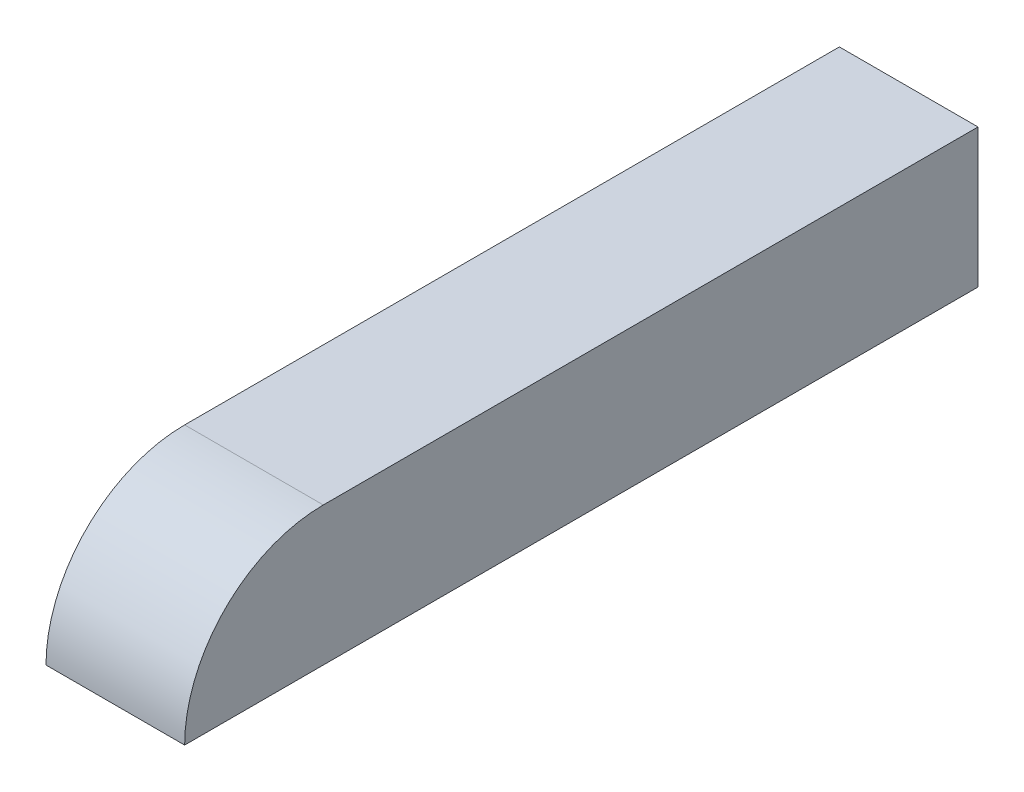
ISO-10303-21;
HEADER;
FILE_DESCRIPTION(('STEP AP214'),'2;1');
FILE_NAME('part.step','',(''),(''),'','','');
FILE_SCHEMA(('AUTOMOTIVE_DESIGN { 1 0 10303 214 1 1 1 1 }'));
ENDSEC;
DATA;
#1=APPLICATION_CONTEXT('core data for automotive mechanical design processes');
#2=APPLICATION_PROTOCOL_DEFINITION('international standard','automotive_design',2000,#1);
#3=PRODUCT_CONTEXT('',#1,'mechanical');
#4=PRODUCT('Part','Part','',(#3));
#5=PRODUCT_RELATED_PRODUCT_CATEGORY('part','',(#4));
#6=PRODUCT_DEFINITION_FORMATION('','',#4);
#7=PRODUCT_DEFINITION_CONTEXT('part definition',#1,'design');
#8=PRODUCT_DEFINITION('design','',#6,#7);
#9=PRODUCT_DEFINITION_SHAPE('','',#8);
#10=(LENGTH_UNIT() NAMED_UNIT(*) SI_UNIT(.MILLI.,.METRE.));
#11=(NAMED_UNIT(*) PLANE_ANGLE_UNIT() SI_UNIT($,.RADIAN.));
#12=(NAMED_UNIT(*) SI_UNIT($,.STERADIAN.) SOLID_ANGLE_UNIT());
#13=UNCERTAINTY_MEASURE_WITH_UNIT(LENGTH_MEASURE(1.E-05),#10,'distance_accuracy_value','');
#14=(GEOMETRIC_REPRESENTATION_CONTEXT(3) GLOBAL_UNCERTAINTY_ASSIGNED_CONTEXT((#13)) GLOBAL_UNIT_ASSIGNED_CONTEXT((#10,
#11,#12)) REPRESENTATION_CONTEXT('',''));
#15=CARTESIAN_POINT('',(0.,0.,0.));
#16=DIRECTION('',(0.,0.,1.));
#17=DIRECTION('',(1.,0.,0.));
#18=AXIS2_PLACEMENT_3D('',#15,#16,#17);
#19=CARTESIAN_POINT('',(13.7705009063984,46.2267058219209,11.5230796597994));
#20=DIRECTION('',(0.,0.,-1.));
#21=DIRECTION('',(-1.,0.,0.));
#22=AXIS2_PLACEMENT_3D('',#19,#20,#21);
#23=PLANE('',#22);
#24=DIRECTION('',(0.,1.,0.));
#25=VECTOR('',#24,1.);
#26=CARTESIAN_POINT('',(31.7705009063984,46.2267058219209,11.5230796597994));
#27=LINE('',#26,#25);
#28=CARTESIAN_POINT('',(31.7705009063984,28.2267058219209,11.5230796597994));
#29=VERTEX_POINT('',#28);
#30=CARTESIAN_POINT('',(31.7705009063984,46.2267058219209,11.5230796597994));
#31=VERTEX_POINT('',#30);
#32=EDGE_CURVE('E176',#29,#31,#27,.T.);
#33=ORIENTED_EDGE('',*,*,#32,.F.);
#34=DIRECTION('',(1.,0.,0.));
#35=VECTOR('',#34,1.);
#36=CARTESIAN_POINT('',(13.7705009063984,28.2267058219209,11.5230796597994));
#37=LINE('',#36,#35);
#38=CARTESIAN_POINT('',(13.7705009063984,28.2267058219209,11.5230796597994));
#39=VERTEX_POINT('',#38);
#40=EDGE_CURVE('E174',#39,#29,#37,.T.);
#41=ORIENTED_EDGE('',*,*,#40,.F.);
#42=DIRECTION('',(0.,1.,0.));
#43=VECTOR('',#42,1.);
#44=CARTESIAN_POINT('',(13.7705009063984,46.2267058219209,11.5230796597994));
#45=LINE('',#44,#43);
#46=CARTESIAN_POINT('',(13.7705009063984,46.2267058219209,11.5230796597994));
#47=VERTEX_POINT('',#46);
#48=EDGE_CURVE('E164',#39,#47,#45,.T.);
#49=ORIENTED_EDGE('',*,*,#48,.T.);
#50=DIRECTION('',(1.,0.,0.));
#51=VECTOR('',#50,1.);
#52=CARTESIAN_POINT('',(13.7705009063984,46.2267058219209,11.5230796597994));
#53=LINE('',#52,#51);
#54=EDGE_CURVE('E187',#47,#31,#53,.T.);
#55=ORIENTED_EDGE('',*,*,#54,.T.);
#56=EDGE_LOOP('',(#33,#41,#49,#55));
#57=FACE_BOUND('',#56,.T.);
#58=DIRECTION('',(1.,0.,0.));
#59=VECTOR('',#58,1.);
#60=CARTESIAN_POINT('',(13.7705009063984,31.2267058219209,11.5230796597994));
#61=LINE('',#60,#59);
#62=CARTESIAN_POINT('',(16.7705009063984,31.2267058219209,11.5230796597994));
#63=VERTEX_POINT('',#62);
#64=CARTESIAN_POINT('',(28.7705009063984,31.2267058219209,11.5230796597994));
#65=VERTEX_POINT('',#64);
#66=EDGE_CURVE('E151',#63,#65,#61,.T.);
#67=ORIENTED_EDGE('',*,*,#66,.T.);
#68=DIRECTION('',(0.,1.,0.));
#69=VECTOR('',#68,1.);
#70=CARTESIAN_POINT('',(28.7705009063984,46.2267058219209,11.5230796597994));
#71=LINE('',#70,#69);
#72=CARTESIAN_POINT('',(28.7705009063984,43.2267058219209,11.5230796597994));
#73=VERTEX_POINT('',#72);
#74=EDGE_CURVE('E137',#65,#73,#71,.T.);
#75=ORIENTED_EDGE('',*,*,#74,.T.);
#76=DIRECTION('',(1.,0.,0.));
#77=VECTOR('',#76,1.);
#78=CARTESIAN_POINT('',(13.7705009063984,43.2267058219209,11.5230796597994));
#79=LINE('',#78,#77);
#80=CARTESIAN_POINT('',(16.7705009063984,43.2267058219209,11.5230796597994));
#81=VERTEX_POINT('',#80);
#82=EDGE_CURVE('E157',#81,#73,#79,.T.);
#83=ORIENTED_EDGE('',*,*,#82,.F.);
#84=DIRECTION('',(0.,1.,0.));
#85=VECTOR('',#84,1.);
#86=CARTESIAN_POINT('',(16.7705009063984,28.2267058219209,11.5230796597994));
#87=LINE('',#86,#85);
#88=EDGE_CURVE('E155',#63,#81,#87,.T.);
#89=ORIENTED_EDGE('',*,*,#88,.F.);
#90=EDGE_LOOP('',(#67,#75,#83,#89));
#91=FACE_BOUND('',#90,.T.);
#92=ADVANCED_FACE('F36',(#57,#91),#23,.T.);
#93=CARTESIAN_POINT('',(13.7705009063984,31.2267058219209,96.5230796597994));
#94=DIRECTION('',(0.,-1.,0.));
#95=DIRECTION('',(0.,0.,-1.));
#96=AXIS2_PLACEMENT_3D('',#93,#94,#95);
#97=PLANE('',#96);
#98=DIRECTION('',(-1.,0.,0.));
#99=VECTOR('',#98,1.);
#100=CARTESIAN_POINT('',(13.7705009063984,31.2267058219209,99.5230796597994));
#101=LINE('',#100,#99);
#102=CARTESIAN_POINT('',(28.7705009063984,31.2267058219209,99.5230796597994));
#103=VERTEX_POINT('',#102);
#104=CARTESIAN_POINT('',(16.7705009063984,31.2267058219209,99.5230796597994));
#105=VERTEX_POINT('',#104);
#106=EDGE_CURVE('E117',#103,#105,#101,.T.);
#107=ORIENTED_EDGE('',*,*,#106,.F.);
#108=DIRECTION('',(0.,0.,-1.));
#109=VECTOR('',#108,1.);
#110=CARTESIAN_POINT('',(28.7705009063984,31.2267058219209,96.5230796597994));
#111=LINE('',#110,#109);
#112=EDGE_CURVE('E129',#103,#65,#111,.T.);
#113=ORIENTED_EDGE('',*,*,#112,.T.);
#114=ORIENTED_EDGE('',*,*,#66,.F.);
#115=DIRECTION('',(0.,0.,-1.));
#116=VECTOR('',#115,1.);
#117=CARTESIAN_POINT('',(16.7705009063984,31.2267058219209,114.523079659799));
#118=LINE('',#117,#116);
#119=EDGE_CURVE('E131',#105,#63,#118,.T.);
#120=ORIENTED_EDGE('',*,*,#119,.F.);
#121=EDGE_LOOP('',(#107,#113,#114,#120));
#122=FACE_BOUND('',#121,.T.);
#123=ADVANCED_FACE('F127',(#122),#97,.F.);
#124=CARTESIAN_POINT('',(13.7705009063984,28.2267058219209,99.5230796597994));
#125=DIRECTION('',(0.,0.,1.));
#126=DIRECTION('',(1.,0.,0.));
#127=AXIS2_PLACEMENT_3D('',#124,#125,#126);
#128=PLANE('',#127);
#129=DIRECTION('',(-1.,0.,0.));
#130=VECTOR('',#129,1.);
#131=CARTESIAN_POINT('',(13.7705009063984,28.2267058219209,99.5230796597994));
#132=LINE('',#131,#130);
#133=CARTESIAN_POINT('',(28.7705009063984,28.2267058219209,99.5230796597994));
#134=VERTEX_POINT('',#133);
#135=CARTESIAN_POINT('',(16.7705009063984,28.2267058219209,99.5230796597994));
#136=VERTEX_POINT('',#135);
#137=EDGE_CURVE('E120',#134,#136,#132,.T.);
#138=ORIENTED_EDGE('',*,*,#137,.F.);
#139=DIRECTION('',(0.,-1.,0.));
#140=VECTOR('',#139,1.);
#141=CARTESIAN_POINT('',(28.7705009063984,28.2267058219209,99.5230796597994));
#142=LINE('',#141,#140);
#143=EDGE_CURVE('E113',#103,#134,#142,.T.);
#144=ORIENTED_EDGE('',*,*,#143,.F.);
#145=ORIENTED_EDGE('',*,*,#106,.T.);
#146=DIRECTION('',(0.,-1.,0.));
#147=VECTOR('',#146,1.);
#148=CARTESIAN_POINT('',(16.7705009063984,28.2267058219209,99.5230796597994));
#149=LINE('',#148,#147);
#150=EDGE_CURVE('E124',#105,#136,#149,.T.);
#151=ORIENTED_EDGE('',*,*,#150,.T.);
#152=EDGE_LOOP('',(#138,#144,#145,#151));
#153=FACE_BOUND('',#152,.T.);
#154=ADVANCED_FACE('F115',(#153),#128,.T.);
#155=CARTESIAN_POINT('',(13.7705009063984,43.2267058219209,96.5230796597994));
#156=DIRECTION('',(0.,1.,0.));
#157=DIRECTION('',(0.,0.,1.));
#158=AXIS2_PLACEMENT_3D('',#155,#156,#157);
#159=PLANE('',#158);
#160=DIRECTION('',(0.,0.,1.));
#161=VECTOR('',#160,1.);
#162=CARTESIAN_POINT('',(28.7705009063984,43.2267058219209,96.5230796597994));
#163=LINE('',#162,#161);
#164=CARTESIAN_POINT('',(28.7705009063984,43.2267058219209,96.5230796597994));
#165=VERTEX_POINT('',#164);
#166=EDGE_CURVE('E140',#73,#165,#163,.T.);
#167=ORIENTED_EDGE('',*,*,#166,.T.);
#168=DIRECTION('',(1.,0.,0.));
#169=VECTOR('',#168,1.);
#170=CARTESIAN_POINT('',(13.7705009063984,43.2267058219209,96.5230796597994));
#171=LINE('',#170,#169);
#172=CARTESIAN_POINT('',(16.7705009063984,43.2267058219209,96.5230796597994));
#173=VERTEX_POINT('',#172);
#174=EDGE_CURVE('E132',#173,#165,#171,.T.);
#175=ORIENTED_EDGE('',*,*,#174,.F.);
#176=DIRECTION('',(0.,0.,1.));
#177=VECTOR('',#176,1.);
#178=CARTESIAN_POINT('',(16.7705009063984,43.2267058219209,114.523079659799));
#179=LINE('',#178,#177);
#180=EDGE_CURVE('E152',#81,#173,#179,.T.);
#181=ORIENTED_EDGE('',*,*,#180,.F.);
#182=ORIENTED_EDGE('',*,*,#82,.T.);
#183=EDGE_LOOP('',(#167,#175,#181,#182));
#184=FACE_BOUND('',#183,.T.);
#185=ADVANCED_FACE('F198',(#184),#159,.F.);
#186=CARTESIAN_POINT('',(16.7705009063984,28.2267058219209,114.523079659799));
#187=DIRECTION('',(1.,0.,0.));
#188=DIRECTION('',(0.,0.,-1.));
#189=AXIS2_PLACEMENT_3D('',#186,#187,#188);
#190=PLANE('',#189);
#191=DIRECTION('',(0.,0.,1.));
#192=VECTOR('',#191,1.);
#193=CARTESIAN_POINT('',(16.7705009063984,28.2267058219209,114.523079659799));
#194=LINE('',#193,#192);
#195=CARTESIAN_POINT('',(16.7705009063984,28.2267058219209,111.523079659799));
#196=VERTEX_POINT('',#195);
#197=EDGE_CURVE('E45',#136,#196,#194,.T.);
#198=ORIENTED_EDGE('',*,*,#197,.F.);
#199=ORIENTED_EDGE('',*,*,#150,.F.);
#200=ORIENTED_EDGE('',*,*,#119,.T.);
#201=ORIENTED_EDGE('',*,*,#88,.T.);
#202=ORIENTED_EDGE('',*,*,#180,.T.);
#203=CARTESIAN_POINT('',(16.7705009063984,28.2267058219209,96.5230796597994));
#204=DIRECTION('',(1.,0.,0.));
#205=DIRECTION('',(0.,0.,-1.));
#206=AXIS2_PLACEMENT_3D('',#203,#204,#205);
#207=CIRCLE('',#206,15.);
#208=EDGE_CURVE('E148',#173,#196,#207,.T.);
#209=ORIENTED_EDGE('',*,*,#208,.T.);
#210=EDGE_LOOP('',(#198,#199,#200,#201,#202,#209));
#211=FACE_BOUND('',#210,.T.);
#212=ADVANCED_FACE('F203',(#211),#190,.T.);
#213=CARTESIAN_POINT('',(28.7705009063984,28.2267058219209,114.523079659799));
#214=DIRECTION('',(-1.,0.,0.));
#215=DIRECTION('',(0.,0.,1.));
#216=AXIS2_PLACEMENT_3D('',#213,#214,#215);
#217=PLANE('',#216);
#218=DIRECTION('',(0.,0.,-1.));
#219=VECTOR('',#218,1.);
#220=CARTESIAN_POINT('',(28.7705009063984,28.2267058219209,114.523079659799));
#221=LINE('',#220,#219);
#222=CARTESIAN_POINT('',(28.7705009063984,28.2267058219209,111.523079659799));
#223=VERTEX_POINT('',#222);
#224=EDGE_CURVE('E40',#223,#134,#221,.T.);
#225=ORIENTED_EDGE('',*,*,#224,.F.);
#226=CARTESIAN_POINT('',(28.7705009063984,28.2267058219209,96.5230796597994));
#227=DIRECTION('',(-1.,0.,0.));
#228=DIRECTION('',(0.,0.,1.));
#229=AXIS2_PLACEMENT_3D('',#226,#227,#228);
#230=CIRCLE('',#229,15.);
#231=EDGE_CURVE('E145',#165,#223,#230,.F.);
#232=ORIENTED_EDGE('',*,*,#231,.F.);
#233=ORIENTED_EDGE('',*,*,#166,.F.);
#234=ORIENTED_EDGE('',*,*,#74,.F.);
#235=ORIENTED_EDGE('',*,*,#112,.F.);
#236=ORIENTED_EDGE('',*,*,#143,.T.);
#237=EDGE_LOOP('',(#225,#232,#233,#234,#235,#236));
#238=FACE_BOUND('',#237,.T.);
#239=ADVANCED_FACE('F134',(#238),#217,.T.);
#240=CARTESIAN_POINT('',(13.7705009063984,28.2267058219209,96.5230796597994));
#241=DIRECTION('',(1.,0.,0.));
#242=DIRECTION('',(0.,0.,-1.));
#243=AXIS2_PLACEMENT_3D('',#240,#241,#242);
#244=CYLINDRICAL_SURFACE('',#243,15.);
#245=ORIENTED_EDGE('',*,*,#231,.T.);
#246=DIRECTION('',(1.,0.,0.));
#247=VECTOR('',#246,1.);
#248=CARTESIAN_POINT('',(13.7705009063984,28.2267058219209,111.523079659799));
#249=LINE('',#248,#247);
#250=EDGE_CURVE('E11',#196,#223,#249,.T.);
#251=ORIENTED_EDGE('',*,*,#250,.F.);
#252=ORIENTED_EDGE('',*,*,#208,.F.);
#253=ORIENTED_EDGE('',*,*,#174,.T.);
#254=EDGE_LOOP('',(#245,#251,#252,#253));
#255=FACE_BOUND('',#254,.T.);
#256=ADVANCED_FACE('F195',(#255),#244,.F.);
#257=CARTESIAN_POINT('',(13.7705009063984,28.2267058219209,114.523079659799));
#258=DIRECTION('',(1.,0.,0.));
#259=DIRECTION('',(0.,0.,-1.));
#260=AXIS2_PLACEMENT_3D('',#257,#258,#259);
#261=PLANE('',#260);
#262=DIRECTION('',(0.,0.,-1.));
#263=VECTOR('',#262,1.);
#264=CARTESIAN_POINT('',(13.7705009063984,28.2267058219209,114.523079659799));
#265=LINE('',#264,#263);
#266=CARTESIAN_POINT('',(13.7705009063984,28.2267058219209,114.523079659799));
#267=VERTEX_POINT('',#266);
#268=EDGE_CURVE('E162',#267,#39,#265,.T.);
#269=ORIENTED_EDGE('',*,*,#268,.F.);
#270=CARTESIAN_POINT('',(13.7705009063984,28.2267058219209,96.5230796597994));
#271=DIRECTION('',(1.,0.,0.));
#272=DIRECTION('',(0.,0.,1.));
#273=AXIS2_PLACEMENT_3D('',#270,#271,#272);
#274=CIRCLE('',#273,18.);
#275=CARTESIAN_POINT('',(13.7705009063984,46.2267058219209,96.5230796597994));
#276=VERTEX_POINT('',#275);
#277=EDGE_CURVE('E171',#276,#267,#274,.T.);
#278=ORIENTED_EDGE('',*,*,#277,.F.);
#279=DIRECTION('',(0.,0.,1.));
#280=VECTOR('',#279,1.);
#281=CARTESIAN_POINT('',(13.7705009063984,46.2267058219209,96.5230796597994));
#282=LINE('',#281,#280);
#283=EDGE_CURVE('E168',#47,#276,#282,.T.);
#284=ORIENTED_EDGE('',*,*,#283,.F.);
#285=ORIENTED_EDGE('',*,*,#48,.F.);
#286=EDGE_LOOP('',(#269,#278,#284,#285));
#287=FACE_BOUND('',#286,.T.);
#288=ADVANCED_FACE('F38',(#287),#261,.F.);
#289=CARTESIAN_POINT('',(13.7705009063984,46.2267058219209,96.5230796597994));
#290=DIRECTION('',(0.,1.,0.));
#291=DIRECTION('',(0.,0.,1.));
#292=AXIS2_PLACEMENT_3D('',#289,#290,#291);
#293=PLANE('',#292);
#294=DIRECTION('',(0.,0.,1.));
#295=VECTOR('',#294,1.);
#296=CARTESIAN_POINT('',(31.7705009063984,46.2267058219209,96.5230796597994));
#297=LINE('',#296,#295);
#298=CARTESIAN_POINT('',(31.7705009063984,46.2267058219209,96.5230796597994));
#299=VERTEX_POINT('',#298);
#300=EDGE_CURVE('E179',#31,#299,#297,.T.);
#301=ORIENTED_EDGE('',*,*,#300,.F.);
#302=ORIENTED_EDGE('',*,*,#54,.F.);
#303=ORIENTED_EDGE('',*,*,#283,.T.);
#304=DIRECTION('',(1.,0.,0.));
#305=VECTOR('',#304,1.);
#306=CARTESIAN_POINT('',(13.7705009063984,46.2267058219209,96.5230796597994));
#307=LINE('',#306,#305);
#308=EDGE_CURVE('E184',#276,#299,#307,.T.);
#309=ORIENTED_EDGE('',*,*,#308,.T.);
#310=EDGE_LOOP('',(#301,#302,#303,#309));
#311=FACE_BOUND('',#310,.T.);
#312=ADVANCED_FACE('F229',(#311),#293,.T.);
#313=CARTESIAN_POINT('',(31.7705009063984,28.2267058219209,114.523079659799));
#314=DIRECTION('',(-1.,0.,0.));
#315=DIRECTION('',(0.,0.,1.));
#316=AXIS2_PLACEMENT_3D('',#313,#314,#315);
#317=PLANE('',#316);
#318=CARTESIAN_POINT('',(31.7705009063984,28.2267058219209,96.5230796597994));
#319=DIRECTION('',(1.,0.,0.));
#320=DIRECTION('',(0.,0.,1.));
#321=AXIS2_PLACEMENT_3D('',#318,#319,#320);
#322=CIRCLE('',#321,18.);
#323=CARTESIAN_POINT('',(31.7705009063984,28.2267058219209,114.523079659799));
#324=VERTEX_POINT('',#323);
#325=EDGE_CURVE('E165',#299,#324,#322,.T.);
#326=ORIENTED_EDGE('',*,*,#325,.T.);
#327=DIRECTION('',(0.,0.,-1.));
#328=VECTOR('',#327,1.);
#329=CARTESIAN_POINT('',(31.7705009063984,28.2267058219209,96.5230796597994));
#330=LINE('',#329,#328);
#331=EDGE_CURVE('E123',#324,#29,#330,.T.);
#332=ORIENTED_EDGE('',*,*,#331,.T.);
#333=ORIENTED_EDGE('',*,*,#32,.T.);
#334=ORIENTED_EDGE('',*,*,#300,.T.);
#335=EDGE_LOOP('',(#326,#332,#333,#334));
#336=FACE_BOUND('',#335,.T.);
#337=ADVANCED_FACE('F223',(#336),#317,.F.);
#338=CARTESIAN_POINT('',(13.7705009063984,28.2267058219209,96.5230796597994));
#339=DIRECTION('',(1.,0.,0.));
#340=DIRECTION('',(0.,0.,-1.));
#341=AXIS2_PLACEMENT_3D('',#338,#339,#340);
#342=CYLINDRICAL_SURFACE('',#341,18.);
#343=ORIENTED_EDGE('',*,*,#325,.F.);
#344=ORIENTED_EDGE('',*,*,#308,.F.);
#345=ORIENTED_EDGE('',*,*,#277,.T.);
#346=DIRECTION('',(1.,0.,0.));
#347=VECTOR('',#346,1.);
#348=CARTESIAN_POINT('',(13.7705009063984,28.2267058219209,114.523079659799));
#349=LINE('',#348,#347);
#350=EDGE_CURVE('E186',#267,#324,#349,.T.);
#351=ORIENTED_EDGE('',*,*,#350,.T.);
#352=EDGE_LOOP('',(#343,#344,#345,#351));
#353=FACE_BOUND('',#352,.T.);
#354=ADVANCED_FACE('F216',(#353),#342,.T.);
#355=CARTESIAN_POINT('',(13.7705009063984,28.2267058219209,96.5230796597994));
#356=DIRECTION('',(0.,-1.,0.));
#357=DIRECTION('',(0.,0.,-1.));
#358=AXIS2_PLACEMENT_3D('',#355,#356,#357);
#359=PLANE('',#358);
#360=ORIENTED_EDGE('',*,*,#331,.F.);
#361=ORIENTED_EDGE('',*,*,#350,.F.);
#362=ORIENTED_EDGE('',*,*,#268,.T.);
#363=ORIENTED_EDGE('',*,*,#40,.T.);
#364=EDGE_LOOP('',(#360,#361,#362,#363));
#365=FACE_BOUND('',#364,.T.);
#366=ORIENTED_EDGE('',*,*,#224,.T.);
#367=ORIENTED_EDGE('',*,*,#137,.T.);
#368=ORIENTED_EDGE('',*,*,#197,.T.);
#369=ORIENTED_EDGE('',*,*,#250,.T.);
#370=EDGE_LOOP('',(#366,#367,#368,#369));
#371=FACE_BOUND('',#370,.T.);
#372=ADVANCED_FACE('F193',(#365,#371),#359,.T.);
#373=CLOSED_SHELL('',(#92,#123,#154,#185,#212,#239,#256,#288,#312,#337,#354,#372));
#374=MANIFOLD_SOLID_BREP('B2',#373);
#375=ADVANCED_BREP_SHAPE_REPRESENTATION('',(#18,#374),#14);
#376=SHAPE_DEFINITION_REPRESENTATION(#9,#375);
ENDSEC;
END-ISO-10303-21;
